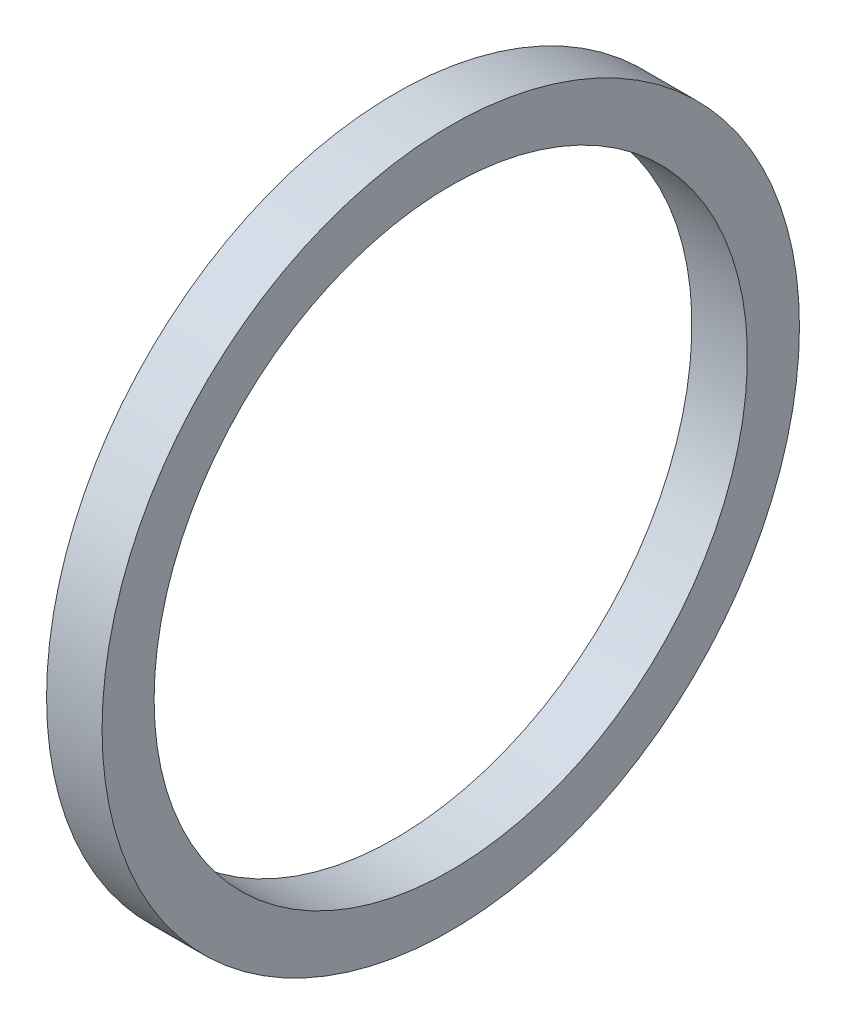
ISO-10303-21;
HEADER;
FILE_DESCRIPTION(('STEP AP214'),'2;1');
FILE_NAME('part.step','',(''),(''),'','','');
FILE_SCHEMA(('AUTOMOTIVE_DESIGN { 1 0 10303 214 1 1 1 1 }'));
ENDSEC;
DATA;
#1=APPLICATION_CONTEXT('core data for automotive mechanical design processes');
#2=APPLICATION_PROTOCOL_DEFINITION('international standard','automotive_design',2000,#1);
#3=PRODUCT_CONTEXT('',#1,'mechanical');
#4=PRODUCT('Part','Part','',(#3));
#5=PRODUCT_RELATED_PRODUCT_CATEGORY('part','',(#4));
#6=PRODUCT_DEFINITION_FORMATION('','',#4);
#7=PRODUCT_DEFINITION_CONTEXT('part definition',#1,'design');
#8=PRODUCT_DEFINITION('design','',#6,#7);
#9=PRODUCT_DEFINITION_SHAPE('','',#8);
#10=(LENGTH_UNIT() NAMED_UNIT(*) SI_UNIT(.MILLI.,.METRE.));
#11=(NAMED_UNIT(*) PLANE_ANGLE_UNIT() SI_UNIT($,.RADIAN.));
#12=(NAMED_UNIT(*) SI_UNIT($,.STERADIAN.) SOLID_ANGLE_UNIT());
#13=UNCERTAINTY_MEASURE_WITH_UNIT(LENGTH_MEASURE(1.E-05),#10,'distance_accuracy_value','');
#14=(GEOMETRIC_REPRESENTATION_CONTEXT(3) GLOBAL_UNCERTAINTY_ASSIGNED_CONTEXT((#13)) GLOBAL_UNIT_ASSIGNED_CONTEXT((#10,
#11,#12)) REPRESENTATION_CONTEXT('',''));
#15=CARTESIAN_POINT('',(0.,0.,0.));
#16=DIRECTION('',(0.,0.,1.));
#17=DIRECTION('',(1.,0.,0.));
#18=AXIS2_PLACEMENT_3D('',#15,#16,#17);
#19=CARTESIAN_POINT('',(0.,0.,0.));
#20=DIRECTION('',(1.,0.,0.));
#21=DIRECTION('',(0.,0.,-1.));
#22=AXIS2_PLACEMENT_3D('',#19,#20,#21);
#23=PLANE('',#22);
#24=CARTESIAN_POINT('',(0.,0.,0.));
#25=DIRECTION('',(-1.,0.,0.));
#26=DIRECTION('',(0.,0.,1.));
#27=AXIS2_PLACEMENT_3D('',#24,#25,#26);
#28=CIRCLE('',#27,17.1);
#29=CARTESIAN_POINT('',(0.,0.,17.1));
#30=VERTEX_POINT('',#29);
#31=EDGE_CURVE('E27',#30,#30,#28,.F.);
#32=ORIENTED_EDGE('',*,*,#31,.T.);
#33=EDGE_LOOP('',(#32));
#34=FACE_BOUND('',#33,.T.);
#35=CARTESIAN_POINT('',(0.,0.,0.));
#36=DIRECTION('',(-1.,0.,0.));
#37=DIRECTION('',(0.,0.,1.));
#38=AXIS2_PLACEMENT_3D('',#35,#36,#37);
#39=CIRCLE('',#38,20.1);
#40=CARTESIAN_POINT('',(0.,0.,20.1));
#41=VERTEX_POINT('',#40);
#42=EDGE_CURVE('E18',#41,#41,#39,.F.);
#43=ORIENTED_EDGE('',*,*,#42,.F.);
#44=EDGE_LOOP('',(#43));
#45=FACE_BOUND('',#44,.T.);
#46=ADVANCED_FACE('F15',(#34,#45),#23,.F.);
#47=CARTESIAN_POINT('',(3.2,0.,0.));
#48=DIRECTION('',(-1.,0.,0.));
#49=DIRECTION('',(0.,0.,1.));
#50=AXIS2_PLACEMENT_3D('',#47,#48,#49);
#51=CYLINDRICAL_SURFACE('',#50,20.1);
#52=ORIENTED_EDGE('',*,*,#42,.T.);
#53=EDGE_LOOP('',(#52));
#54=FACE_BOUND('',#53,.T.);
#55=CARTESIAN_POINT('',(3.2,0.,0.));
#56=DIRECTION('',(-1.,0.,0.));
#57=DIRECTION('',(0.,0.,1.));
#58=AXIS2_PLACEMENT_3D('',#55,#56,#57);
#59=CIRCLE('',#58,20.1);
#60=CARTESIAN_POINT('',(3.2,0.,20.1));
#61=VERTEX_POINT('',#60);
#62=EDGE_CURVE('E22',#61,#61,#59,.F.);
#63=ORIENTED_EDGE('',*,*,#62,.F.);
#64=EDGE_LOOP('',(#63));
#65=FACE_BOUND('',#64,.T.);
#66=ADVANCED_FACE('F35',(#54,#65),#51,.T.);
#67=CARTESIAN_POINT('',(3.2,0.,0.));
#68=DIRECTION('',(-1.,0.,0.));
#69=DIRECTION('',(0.,0.,1.));
#70=AXIS2_PLACEMENT_3D('',#67,#68,#69);
#71=CYLINDRICAL_SURFACE('',#70,17.1);
#72=CARTESIAN_POINT('',(3.2,0.,0.));
#73=DIRECTION('',(-1.,0.,0.));
#74=DIRECTION('',(0.,0.,1.));
#75=AXIS2_PLACEMENT_3D('',#72,#73,#74);
#76=CIRCLE('',#75,17.1);
#77=CARTESIAN_POINT('',(3.2,0.,17.1));
#78=VERTEX_POINT('',#77);
#79=EDGE_CURVE('E10',#78,#78,#76,.T.);
#80=ORIENTED_EDGE('',*,*,#79,.F.);
#81=EDGE_LOOP('',(#80));
#82=FACE_BOUND('',#81,.T.);
#83=ORIENTED_EDGE('',*,*,#31,.F.);
#84=EDGE_LOOP('',(#83));
#85=FACE_BOUND('',#84,.T.);
#86=ADVANCED_FACE('F43',(#82,#85),#71,.F.);
#87=CARTESIAN_POINT('',(3.2,0.,0.));
#88=DIRECTION('',(1.,0.,0.));
#89=DIRECTION('',(0.,0.,-1.));
#90=AXIS2_PLACEMENT_3D('',#87,#88,#89);
#91=PLANE('',#90);
#92=ORIENTED_EDGE('',*,*,#79,.T.);
#93=EDGE_LOOP('',(#92));
#94=FACE_BOUND('',#93,.T.);
#95=ORIENTED_EDGE('',*,*,#62,.T.);
#96=EDGE_LOOP('',(#95));
#97=FACE_BOUND('',#96,.T.);
#98=ADVANCED_FACE('F44',(#94,#97),#91,.T.);
#99=CLOSED_SHELL('',(#46,#66,#86,#98));
#100=MANIFOLD_SOLID_BREP('B1',#99);
#101=ADVANCED_BREP_SHAPE_REPRESENTATION('',(#18,#100),#14);
#102=SHAPE_DEFINITION_REPRESENTATION(#9,#101);
ENDSEC;
END-ISO-10303-21;
